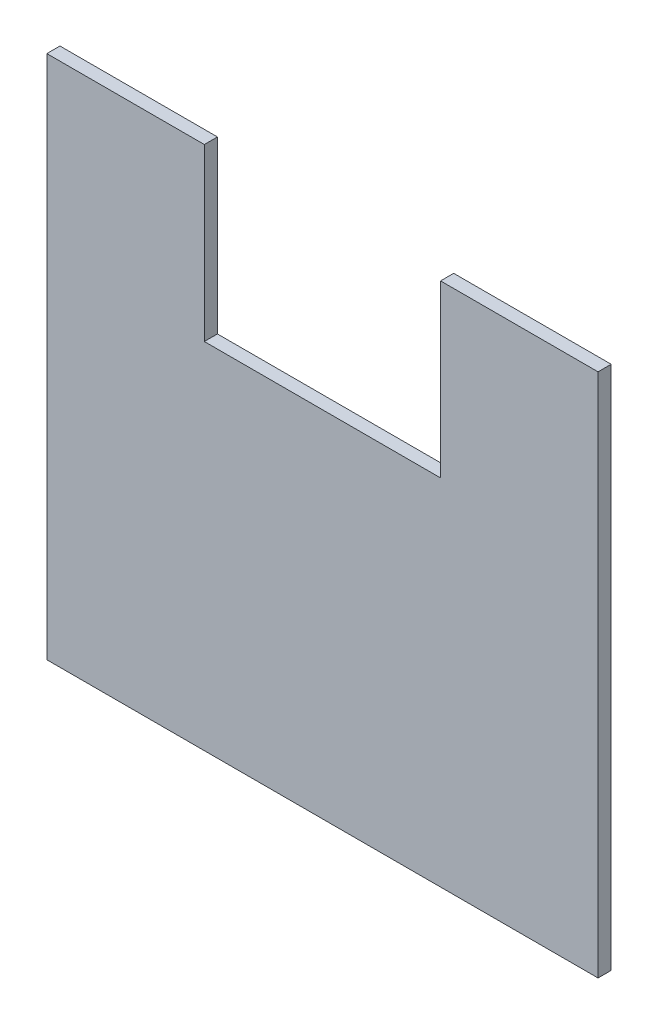
ISO-10303-21;
HEADER;
FILE_DESCRIPTION(('STEP AP214'),'2;1');
FILE_NAME('part.step','',(''),(''),'','','');
FILE_SCHEMA(('AUTOMOTIVE_DESIGN { 1 0 10303 214 1 1 1 1 }'));
ENDSEC;
DATA;
#1=APPLICATION_CONTEXT('core data for automotive mechanical design processes');
#2=APPLICATION_PROTOCOL_DEFINITION('international standard','automotive_design',2000,#1);
#3=PRODUCT_CONTEXT('',#1,'mechanical');
#4=PRODUCT('Part','Part','',(#3));
#5=PRODUCT_RELATED_PRODUCT_CATEGORY('part','',(#4));
#6=PRODUCT_DEFINITION_FORMATION('','',#4);
#7=PRODUCT_DEFINITION_CONTEXT('part definition',#1,'design');
#8=PRODUCT_DEFINITION('design','',#6,#7);
#9=PRODUCT_DEFINITION_SHAPE('','',#8);
#10=(LENGTH_UNIT() NAMED_UNIT(*) SI_UNIT(.MILLI.,.METRE.));
#11=(NAMED_UNIT(*) PLANE_ANGLE_UNIT() SI_UNIT($,.RADIAN.));
#12=(NAMED_UNIT(*) SI_UNIT($,.STERADIAN.) SOLID_ANGLE_UNIT());
#13=UNCERTAINTY_MEASURE_WITH_UNIT(LENGTH_MEASURE(1.E-05),#10,'distance_accuracy_value','');
#14=(GEOMETRIC_REPRESENTATION_CONTEXT(3) GLOBAL_UNCERTAINTY_ASSIGNED_CONTEXT((#13)) GLOBAL_UNIT_ASSIGNED_CONTEXT((#10,
#11,#12)) REPRESENTATION_CONTEXT('',''));
#15=CARTESIAN_POINT('',(0.,0.,0.));
#16=DIRECTION('',(0.,0.,1.));
#17=DIRECTION('',(1.,0.,0.));
#18=AXIS2_PLACEMENT_3D('',#15,#16,#17);
#19=CARTESIAN_POINT('',(-210.,0.,5.));
#20=DIRECTION('',(1.,0.,0.));
#21=DIRECTION('',(0.,0.,-1.));
#22=AXIS2_PLACEMENT_3D('',#19,#20,#21);
#23=PLANE('',#22);
#24=DIRECTION('',(0.,-1.,0.));
#25=VECTOR('',#24,1.);
#26=CARTESIAN_POINT('',(-210.,0.,0.));
#27=LINE('',#26,#25);
#28=CARTESIAN_POINT('',(-210.,200.,0.));
#29=VERTEX_POINT('',#28);
#30=CARTESIAN_POINT('',(-210.,0.,0.));
#31=VERTEX_POINT('',#30);
#32=EDGE_CURVE('E131',#29,#31,#27,.T.);
#33=ORIENTED_EDGE('',*,*,#32,.T.);
#34=DIRECTION('',(0.,0.,-1.));
#35=VECTOR('',#34,1.);
#36=CARTESIAN_POINT('',(-210.,0.,5.));
#37=LINE('',#36,#35);
#38=CARTESIAN_POINT('',(-210.,0.,5.));
#39=VERTEX_POINT('',#38);
#40=EDGE_CURVE('E11',#39,#31,#37,.T.);
#41=ORIENTED_EDGE('',*,*,#40,.F.);
#42=DIRECTION('',(0.,-1.,0.));
#43=VECTOR('',#42,1.);
#44=CARTESIAN_POINT('',(-210.,0.,5.));
#45=LINE('',#44,#43);
#46=CARTESIAN_POINT('',(-210.,200.,5.));
#47=VERTEX_POINT('',#46);
#48=EDGE_CURVE('E145',#47,#39,#45,.T.);
#49=ORIENTED_EDGE('',*,*,#48,.F.);
#50=DIRECTION('',(0.,0.,-1.));
#51=VECTOR('',#50,1.);
#52=CARTESIAN_POINT('',(-210.,200.,5.));
#53=LINE('',#52,#51);
#54=EDGE_CURVE('E127',#47,#29,#53,.T.);
#55=ORIENTED_EDGE('',*,*,#54,.T.);
#56=EDGE_LOOP('',(#33,#41,#49,#55));
#57=FACE_BOUND('',#56,.T.);
#58=ADVANCED_FACE('F35',(#57),#23,.F.);
#59=CARTESIAN_POINT('',(0.,0.,5.));
#60=DIRECTION('',(0.,1.,0.));
#61=DIRECTION('',(-1.,0.,0.));
#62=AXIS2_PLACEMENT_3D('',#59,#60,#61);
#63=PLANE('',#62);
#64=DIRECTION('',(1.,0.,0.));
#65=VECTOR('',#64,1.);
#66=CARTESIAN_POINT('',(0.,0.,0.));
#67=LINE('',#66,#65);
#68=CARTESIAN_POINT('',(0.,0.,0.));
#69=VERTEX_POINT('',#68);
#70=EDGE_CURVE('E134',#31,#69,#67,.T.);
#71=ORIENTED_EDGE('',*,*,#70,.T.);
#72=DIRECTION('',(0.,0.,-1.));
#73=VECTOR('',#72,1.);
#74=CARTESIAN_POINT('',(0.,0.,5.));
#75=LINE('',#74,#73);
#76=CARTESIAN_POINT('',(0.,0.,5.));
#77=VERTEX_POINT('',#76);
#78=EDGE_CURVE('E43',#77,#69,#75,.T.);
#79=ORIENTED_EDGE('',*,*,#78,.F.);
#80=DIRECTION('',(1.,0.,0.));
#81=VECTOR('',#80,1.);
#82=CARTESIAN_POINT('',(0.,0.,5.));
#83=LINE('',#82,#81);
#84=EDGE_CURVE('E94',#39,#77,#83,.T.);
#85=ORIENTED_EDGE('',*,*,#84,.F.);
#86=ORIENTED_EDGE('',*,*,#40,.T.);
#87=EDGE_LOOP('',(#71,#79,#85,#86));
#88=FACE_BOUND('',#87,.T.);
#89=ADVANCED_FACE('F180',(#88),#63,.F.);
#90=CARTESIAN_POINT('',(0.,200.,5.));
#91=DIRECTION('',(-1.,0.,0.));
#92=DIRECTION('',(0.,-1.,0.));
#93=AXIS2_PLACEMENT_3D('',#90,#91,#92);
#94=PLANE('',#93);
#95=DIRECTION('',(0.,1.,0.));
#96=VECTOR('',#95,1.);
#97=CARTESIAN_POINT('',(0.,200.,0.));
#98=LINE('',#97,#96);
#99=CARTESIAN_POINT('',(0.,200.,0.));
#100=VERTEX_POINT('',#99);
#101=EDGE_CURVE('E136',#69,#100,#98,.T.);
#102=ORIENTED_EDGE('',*,*,#101,.T.);
#103=DIRECTION('',(0.,0.,-1.));
#104=VECTOR('',#103,1.);
#105=CARTESIAN_POINT('',(0.,200.,5.));
#106=LINE('',#105,#104);
#107=CARTESIAN_POINT('',(0.,200.,5.));
#108=VERTEX_POINT('',#107);
#109=EDGE_CURVE('E152',#108,#100,#106,.T.);
#110=ORIENTED_EDGE('',*,*,#109,.F.);
#111=DIRECTION('',(0.,1.,0.));
#112=VECTOR('',#111,1.);
#113=CARTESIAN_POINT('',(0.,200.,5.));
#114=LINE('',#113,#112);
#115=EDGE_CURVE('E160',#77,#108,#114,.T.);
#116=ORIENTED_EDGE('',*,*,#115,.F.);
#117=ORIENTED_EDGE('',*,*,#78,.T.);
#118=EDGE_LOOP('',(#102,#110,#116,#117));
#119=FACE_BOUND('',#118,.T.);
#120=ADVANCED_FACE('F158',(#119),#94,.F.);
#121=CARTESIAN_POINT('',(-60.,200.,5.));
#122=DIRECTION('',(0.,-1.,0.));
#123=DIRECTION('',(0.,0.,-1.));
#124=AXIS2_PLACEMENT_3D('',#121,#122,#123);
#125=PLANE('',#124);
#126=DIRECTION('',(-1.,0.,0.));
#127=VECTOR('',#126,1.);
#128=CARTESIAN_POINT('',(-60.,200.,0.));
#129=LINE('',#128,#127);
#130=CARTESIAN_POINT('',(-60.,200.,0.));
#131=VERTEX_POINT('',#130);
#132=EDGE_CURVE('E138',#100,#131,#129,.T.);
#133=ORIENTED_EDGE('',*,*,#132,.T.);
#134=DIRECTION('',(0.,0.,-1.));
#135=VECTOR('',#134,1.);
#136=CARTESIAN_POINT('',(-60.,200.,5.));
#137=LINE('',#136,#135);
#138=CARTESIAN_POINT('',(-60.,200.,5.));
#139=VERTEX_POINT('',#138);
#140=EDGE_CURVE('E149',#139,#131,#137,.T.);
#141=ORIENTED_EDGE('',*,*,#140,.F.);
#142=DIRECTION('',(-1.,0.,0.));
#143=VECTOR('',#142,1.);
#144=CARTESIAN_POINT('',(-60.,200.,5.));
#145=LINE('',#144,#143);
#146=EDGE_CURVE('E172',#108,#139,#145,.T.);
#147=ORIENTED_EDGE('',*,*,#146,.F.);
#148=ORIENTED_EDGE('',*,*,#109,.T.);
#149=EDGE_LOOP('',(#133,#141,#147,#148));
#150=FACE_BOUND('',#149,.T.);
#151=ADVANCED_FACE('F168',(#150),#125,.F.);
#152=CARTESIAN_POINT('',(-60.,135.,5.));
#153=DIRECTION('',(1.,0.,0.));
#154=DIRECTION('',(0.,0.,-1.));
#155=AXIS2_PLACEMENT_3D('',#152,#153,#154);
#156=PLANE('',#155);
#157=DIRECTION('',(0.,-1.,0.));
#158=VECTOR('',#157,1.);
#159=CARTESIAN_POINT('',(-60.,135.,0.));
#160=LINE('',#159,#158);
#161=CARTESIAN_POINT('',(-60.,135.,0.));
#162=VERTEX_POINT('',#161);
#163=EDGE_CURVE('E140',#131,#162,#160,.T.);
#164=ORIENTED_EDGE('',*,*,#163,.T.);
#165=DIRECTION('',(0.,0.,-1.));
#166=VECTOR('',#165,1.);
#167=CARTESIAN_POINT('',(-60.,135.,5.));
#168=LINE('',#167,#166);
#169=CARTESIAN_POINT('',(-60.,135.,5.));
#170=VERTEX_POINT('',#169);
#171=EDGE_CURVE('E122',#170,#162,#168,.T.);
#172=ORIENTED_EDGE('',*,*,#171,.F.);
#173=DIRECTION('',(0.,-1.,0.));
#174=VECTOR('',#173,1.);
#175=CARTESIAN_POINT('',(-60.,135.,5.));
#176=LINE('',#175,#174);
#177=EDGE_CURVE('E113',#139,#170,#176,.T.);
#178=ORIENTED_EDGE('',*,*,#177,.F.);
#179=ORIENTED_EDGE('',*,*,#140,.T.);
#180=EDGE_LOOP('',(#164,#172,#178,#179));
#181=FACE_BOUND('',#180,.T.);
#182=ADVANCED_FACE('F171',(#181),#156,.F.);
#183=CARTESIAN_POINT('',(-150.,135.,5.));
#184=DIRECTION('',(0.,-1.,0.));
#185=DIRECTION('',(0.,0.,-1.));
#186=AXIS2_PLACEMENT_3D('',#183,#184,#185);
#187=PLANE('',#186);
#188=DIRECTION('',(-1.,0.,0.));
#189=VECTOR('',#188,1.);
#190=CARTESIAN_POINT('',(-150.,135.,0.));
#191=LINE('',#190,#189);
#192=CARTESIAN_POINT('',(-150.,135.,0.));
#193=VERTEX_POINT('',#192);
#194=EDGE_CURVE('E121',#162,#193,#191,.T.);
#195=ORIENTED_EDGE('',*,*,#194,.T.);
#196=DIRECTION('',(0.,0.,-1.));
#197=VECTOR('',#196,1.);
#198=CARTESIAN_POINT('',(-150.,135.,5.));
#199=LINE('',#198,#197);
#200=CARTESIAN_POINT('',(-150.,135.,5.));
#201=VERTEX_POINT('',#200);
#202=EDGE_CURVE('E118',#201,#193,#199,.T.);
#203=ORIENTED_EDGE('',*,*,#202,.F.);
#204=DIRECTION('',(-1.,0.,0.));
#205=VECTOR('',#204,1.);
#206=CARTESIAN_POINT('',(-150.,135.,5.));
#207=LINE('',#206,#205);
#208=EDGE_CURVE('E107',#170,#201,#207,.T.);
#209=ORIENTED_EDGE('',*,*,#208,.F.);
#210=ORIENTED_EDGE('',*,*,#171,.T.);
#211=EDGE_LOOP('',(#195,#203,#209,#210));
#212=FACE_BOUND('',#211,.T.);
#213=ADVANCED_FACE('F119',(#212),#187,.F.);
#214=CARTESIAN_POINT('',(-150.,200.,5.));
#215=DIRECTION('',(-1.,0.,0.));
#216=DIRECTION('',(0.,0.,1.));
#217=AXIS2_PLACEMENT_3D('',#214,#215,#216);
#218=PLANE('',#217);
#219=DIRECTION('',(0.,1.,0.));
#220=VECTOR('',#219,1.);
#221=CARTESIAN_POINT('',(-150.,200.,0.));
#222=LINE('',#221,#220);
#223=CARTESIAN_POINT('',(-150.,200.,0.));
#224=VERTEX_POINT('',#223);
#225=EDGE_CURVE('E80',#193,#224,#222,.T.);
#226=ORIENTED_EDGE('',*,*,#225,.T.);
#227=DIRECTION('',(0.,0.,-1.));
#228=VECTOR('',#227,1.);
#229=CARTESIAN_POINT('',(-150.,200.,5.));
#230=LINE('',#229,#228);
#231=CARTESIAN_POINT('',(-150.,200.,5.));
#232=VERTEX_POINT('',#231);
#233=EDGE_CURVE('E123',#232,#224,#230,.T.);
#234=ORIENTED_EDGE('',*,*,#233,.F.);
#235=DIRECTION('',(0.,1.,0.));
#236=VECTOR('',#235,1.);
#237=CARTESIAN_POINT('',(-150.,200.,5.));
#238=LINE('',#237,#236);
#239=EDGE_CURVE('E111',#201,#232,#238,.T.);
#240=ORIENTED_EDGE('',*,*,#239,.F.);
#241=ORIENTED_EDGE('',*,*,#202,.T.);
#242=EDGE_LOOP('',(#226,#234,#240,#241));
#243=FACE_BOUND('',#242,.T.);
#244=ADVANCED_FACE('F125',(#243),#218,.F.);
#245=CARTESIAN_POINT('',(-210.,200.,5.));
#246=DIRECTION('',(0.,-1.,0.));
#247=DIRECTION('',(0.,0.,-1.));
#248=AXIS2_PLACEMENT_3D('',#245,#246,#247);
#249=PLANE('',#248);
#250=DIRECTION('',(-1.,0.,0.));
#251=VECTOR('',#250,1.);
#252=CARTESIAN_POINT('',(-210.,200.,0.));
#253=LINE('',#252,#251);
#254=EDGE_CURVE('E86',#224,#29,#253,.T.);
#255=ORIENTED_EDGE('',*,*,#254,.T.);
#256=ORIENTED_EDGE('',*,*,#54,.F.);
#257=DIRECTION('',(-1.,0.,0.));
#258=VECTOR('',#257,1.);
#259=CARTESIAN_POINT('',(-210.,200.,5.));
#260=LINE('',#259,#258);
#261=EDGE_CURVE('E51',#232,#47,#260,.T.);
#262=ORIENTED_EDGE('',*,*,#261,.F.);
#263=ORIENTED_EDGE('',*,*,#233,.T.);
#264=EDGE_LOOP('',(#255,#256,#262,#263));
#265=FACE_BOUND('',#264,.T.);
#266=ADVANCED_FACE('F196',(#265),#249,.F.);
#267=CARTESIAN_POINT('',(0.,0.,5.));
#268=DIRECTION('',(0.,0.,-1.));
#269=DIRECTION('',(-1.,0.,0.));
#270=AXIS2_PLACEMENT_3D('',#267,#268,#269);
#271=PLANE('',#270);
#272=ORIENTED_EDGE('',*,*,#48,.T.);
#273=ORIENTED_EDGE('',*,*,#84,.T.);
#274=ORIENTED_EDGE('',*,*,#115,.T.);
#275=ORIENTED_EDGE('',*,*,#146,.T.);
#276=ORIENTED_EDGE('',*,*,#177,.T.);
#277=ORIENTED_EDGE('',*,*,#208,.T.);
#278=ORIENTED_EDGE('',*,*,#239,.T.);
#279=ORIENTED_EDGE('',*,*,#261,.T.);
#280=EDGE_LOOP('',(#272,#273,#274,#275,#276,#277,#278,#279));
#281=FACE_BOUND('',#280,.T.);
#282=ADVANCED_FACE('F109',(#281),#271,.F.);
#283=CARTESIAN_POINT('',(0.,0.,0.));
#284=DIRECTION('',(0.,0.,-1.));
#285=DIRECTION('',(-1.,0.,0.));
#286=AXIS2_PLACEMENT_3D('',#283,#284,#285);
#287=PLANE('',#286);
#288=ORIENTED_EDGE('',*,*,#32,.F.);
#289=ORIENTED_EDGE('',*,*,#254,.F.);
#290=ORIENTED_EDGE('',*,*,#225,.F.);
#291=ORIENTED_EDGE('',*,*,#194,.F.);
#292=ORIENTED_EDGE('',*,*,#163,.F.);
#293=ORIENTED_EDGE('',*,*,#132,.F.);
#294=ORIENTED_EDGE('',*,*,#101,.F.);
#295=ORIENTED_EDGE('',*,*,#70,.F.);
#296=EDGE_LOOP('',(#288,#289,#290,#291,#292,#293,#294,#295));
#297=FACE_BOUND('',#296,.T.);
#298=ADVANCED_FACE('F164',(#297),#287,.T.);
#299=CLOSED_SHELL('',(#58,#89,#120,#151,#182,#213,#244,#266,#282,#298));
#300=MANIFOLD_SOLID_BREP('B2',#299);
#301=ADVANCED_BREP_SHAPE_REPRESENTATION('',(#18,#300),#14);
#302=SHAPE_DEFINITION_REPRESENTATION(#9,#301);
ENDSEC;
END-ISO-10303-21;
